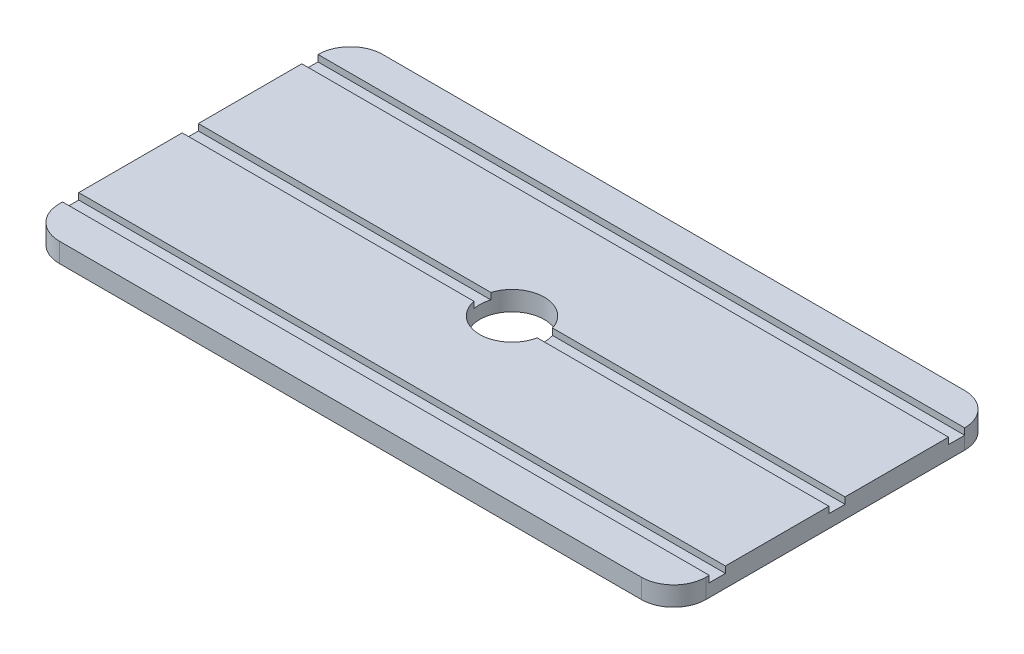
ISO-10303-21;
HEADER;
FILE_DESCRIPTION(('STEP AP214'),'2;1');
FILE_NAME('part.step','',(''),(''),'','','');
FILE_SCHEMA(('AUTOMOTIVE_DESIGN { 1 0 10303 214 1 1 1 1 }'));
ENDSEC;
DATA;
#1=APPLICATION_CONTEXT('core data for automotive mechanical design processes');
#2=APPLICATION_PROTOCOL_DEFINITION('international standard','automotive_design',2000,#1);
#3=PRODUCT_CONTEXT('',#1,'mechanical');
#4=PRODUCT('Part','Part','',(#3));
#5=PRODUCT_RELATED_PRODUCT_CATEGORY('part','',(#4));
#6=PRODUCT_DEFINITION_FORMATION('','',#4);
#7=PRODUCT_DEFINITION_CONTEXT('part definition',#1,'design');
#8=PRODUCT_DEFINITION('design','',#6,#7);
#9=PRODUCT_DEFINITION_SHAPE('','',#8);
#10=(LENGTH_UNIT() NAMED_UNIT(*) SI_UNIT(.MILLI.,.METRE.));
#11=(NAMED_UNIT(*) PLANE_ANGLE_UNIT() SI_UNIT($,.RADIAN.));
#12=(NAMED_UNIT(*) SI_UNIT($,.STERADIAN.) SOLID_ANGLE_UNIT());
#13=UNCERTAINTY_MEASURE_WITH_UNIT(LENGTH_MEASURE(1.E-05),#10,'distance_accuracy_value','');
#14=(GEOMETRIC_REPRESENTATION_CONTEXT(3) GLOBAL_UNCERTAINTY_ASSIGNED_CONTEXT((#13)) GLOBAL_UNIT_ASSIGNED_CONTEXT((#10,
#11,#12)) REPRESENTATION_CONTEXT('',''));
#15=CARTESIAN_POINT('',(0.,0.,0.));
#16=DIRECTION('',(0.,0.,1.));
#17=DIRECTION('',(1.,0.,0.));
#18=AXIS2_PLACEMENT_3D('',#15,#16,#17);
#19=CARTESIAN_POINT('',(-50.,3.,25.));
#20=DIRECTION('',(1.,0.,0.));
#21=DIRECTION('',(0.,0.,-1.));
#22=AXIS2_PLACEMENT_3D('',#19,#20,#21);
#23=PLANE('',#22);
#24=DIRECTION('',(0.,0.,1.));
#25=VECTOR('',#24,1.);
#26=CARTESIAN_POINT('',(-50.,3.,25.));
#27=LINE('',#26,#25);
#28=CARTESIAN_POINT('',(-50.,3.,-17.5));
#29=VERTEX_POINT('',#28);
#30=CARTESIAN_POINT('',(-50.,3.,-1.5));
#31=VERTEX_POINT('',#30);
#32=EDGE_CURVE('E213',#29,#31,#27,.T.);
#33=ORIENTED_EDGE('',*,*,#32,.F.);
#34=DIRECTION('',(0.,1.,0.));
#35=VECTOR('',#34,1.);
#36=CARTESIAN_POINT('',(-50.,2.,-17.5));
#37=LINE('',#36,#35);
#38=CARTESIAN_POINT('',(-50.,2.,-17.5));
#39=VERTEX_POINT('',#38);
#40=EDGE_CURVE('E197',#39,#29,#37,.T.);
#41=ORIENTED_EDGE('',*,*,#40,.F.);
#42=DIRECTION('',(0.,0.,1.));
#43=VECTOR('',#42,1.);
#44=CARTESIAN_POINT('',(-50.,2.,0.));
#45=LINE('',#44,#43);
#46=CARTESIAN_POINT('',(-50.,2.,-20.));
#47=VERTEX_POINT('',#46);
#48=EDGE_CURVE('E201',#47,#39,#45,.T.);
#49=ORIENTED_EDGE('',*,*,#48,.F.);
#50=DIRECTION('',(0.,-1.,0.));
#51=VECTOR('',#50,1.);
#52=CARTESIAN_POINT('',(-50.,3.,-20.));
#53=LINE('',#52,#51);
#54=CARTESIAN_POINT('',(-50.,0.,-20.));
#55=VERTEX_POINT('',#54);
#56=EDGE_CURVE('E332',#47,#55,#53,.T.);
#57=ORIENTED_EDGE('',*,*,#56,.T.);
#58=DIRECTION('',(0.,0.,1.));
#59=VECTOR('',#58,1.);
#60=CARTESIAN_POINT('',(-50.,0.,25.));
#61=LINE('',#60,#59);
#62=CARTESIAN_POINT('',(-50.,0.,20.));
#63=VERTEX_POINT('',#62);
#64=EDGE_CURVE('E299',#55,#63,#61,.T.);
#65=ORIENTED_EDGE('',*,*,#64,.T.);
#66=DIRECTION('',(0.,-1.,0.));
#67=VECTOR('',#66,1.);
#68=CARTESIAN_POINT('',(-50.,3.,20.));
#69=LINE('',#68,#67);
#70=CARTESIAN_POINT('',(-50.,3.,20.));
#71=VERTEX_POINT('',#70);
#72=EDGE_CURVE('E319',#63,#71,#69,.F.);
#73=ORIENTED_EDGE('',*,*,#72,.T.);
#74=CARTESIAN_POINT('',(-50.,3.,19.5));
#75=VERTEX_POINT('',#74);
#76=EDGE_CURVE('E304',#75,#71,#27,.T.);
#77=ORIENTED_EDGE('',*,*,#76,.F.);
#78=DIRECTION('',(0.,1.,0.));
#79=VECTOR('',#78,1.);
#80=CARTESIAN_POINT('',(-50.,2.,19.5));
#81=LINE('',#80,#79);
#82=CARTESIAN_POINT('',(-50.,2.,19.5));
#83=VERTEX_POINT('',#82);
#84=EDGE_CURVE('E53',#83,#75,#81,.T.);
#85=ORIENTED_EDGE('',*,*,#84,.F.);
#86=DIRECTION('',(0.,0.,1.));
#87=VECTOR('',#86,1.);
#88=CARTESIAN_POINT('',(-50.,2.,0.));
#89=LINE('',#88,#87);
#90=CARTESIAN_POINT('',(-50.,2.,17.));
#91=VERTEX_POINT('',#90);
#92=EDGE_CURVE('E272',#91,#83,#89,.T.);
#93=ORIENTED_EDGE('',*,*,#92,.F.);
#94=DIRECTION('',(0.,1.,0.));
#95=VECTOR('',#94,1.);
#96=CARTESIAN_POINT('',(-50.,2.,17.));
#97=LINE('',#96,#95);
#98=CARTESIAN_POINT('',(-50.,3.,17.));
#99=VERTEX_POINT('',#98);
#100=EDGE_CURVE('E261',#91,#99,#97,.T.);
#101=ORIENTED_EDGE('',*,*,#100,.T.);
#102=CARTESIAN_POINT('',(-50.,3.,1.));
#103=VERTEX_POINT('',#102);
#104=EDGE_CURVE('E306',#103,#99,#27,.T.);
#105=ORIENTED_EDGE('',*,*,#104,.F.);
#106=DIRECTION('',(0.,1.,0.));
#107=VECTOR('',#106,1.);
#108=CARTESIAN_POINT('',(-50.,2.,1.));
#109=LINE('',#108,#107);
#110=CARTESIAN_POINT('',(-50.,2.,1.));
#111=VERTEX_POINT('',#110);
#112=EDGE_CURVE('E231',#111,#103,#109,.T.);
#113=ORIENTED_EDGE('',*,*,#112,.F.);
#114=DIRECTION('',(0.,0.,1.));
#115=VECTOR('',#114,1.);
#116=CARTESIAN_POINT('',(-50.,2.,0.));
#117=LINE('',#116,#115);
#118=CARTESIAN_POINT('',(-50.,2.,-1.5));
#119=VERTEX_POINT('',#118);
#120=EDGE_CURVE('E220',#119,#111,#117,.T.);
#121=ORIENTED_EDGE('',*,*,#120,.F.);
#122=DIRECTION('',(0.,1.,0.));
#123=VECTOR('',#122,1.);
#124=CARTESIAN_POINT('',(-50.,2.,-1.5));
#125=LINE('',#124,#123);
#126=EDGE_CURVE('E237',#119,#31,#125,.T.);
#127=ORIENTED_EDGE('',*,*,#126,.T.);
#128=EDGE_LOOP('',(#33,#41,#49,#57,#65,#73,#77,#85,#93,#101,#105,#113,#121,#127));
#129=FACE_BOUND('',#128,.T.);
#130=ADVANCED_FACE('F38',(#129),#23,.F.);
#131=CARTESIAN_POINT('',(50.,3.,25.));
#132=DIRECTION('',(-1.,0.,0.));
#133=DIRECTION('',(0.,0.,1.));
#134=AXIS2_PLACEMENT_3D('',#131,#132,#133);
#135=PLANE('',#134);
#136=DIRECTION('',(0.,0.,-1.));
#137=VECTOR('',#136,1.);
#138=CARTESIAN_POINT('',(50.,2.,0.));
#139=LINE('',#138,#137);
#140=CARTESIAN_POINT('',(50.,2.,-17.5));
#141=VERTEX_POINT('',#140);
#142=CARTESIAN_POINT('',(50.,2.,-20.));
#143=VERTEX_POINT('',#142);
#144=EDGE_CURVE('E61',#141,#143,#139,.T.);
#145=ORIENTED_EDGE('',*,*,#144,.F.);
#146=DIRECTION('',(0.,1.,0.));
#147=VECTOR('',#146,1.);
#148=CARTESIAN_POINT('',(50.,2.,-17.5));
#149=LINE('',#148,#147);
#150=CARTESIAN_POINT('',(50.,3.,-17.5));
#151=VERTEX_POINT('',#150);
#152=EDGE_CURVE('E200',#141,#151,#149,.T.);
#153=ORIENTED_EDGE('',*,*,#152,.T.);
#154=DIRECTION('',(0.,0.,-1.));
#155=VECTOR('',#154,1.);
#156=CARTESIAN_POINT('',(50.,3.,25.));
#157=LINE('',#156,#155);
#158=CARTESIAN_POINT('',(50.,3.,-1.5));
#159=VERTEX_POINT('',#158);
#160=EDGE_CURVE('E311',#159,#151,#157,.T.);
#161=ORIENTED_EDGE('',*,*,#160,.F.);
#162=DIRECTION('',(0.,1.,0.));
#163=VECTOR('',#162,1.);
#164=CARTESIAN_POINT('',(50.,2.,-1.5));
#165=LINE('',#164,#163);
#166=CARTESIAN_POINT('',(50.,2.,-1.5));
#167=VERTEX_POINT('',#166);
#168=EDGE_CURVE('E266',#167,#159,#165,.T.);
#169=ORIENTED_EDGE('',*,*,#168,.F.);
#170=DIRECTION('',(0.,0.,-1.));
#171=VECTOR('',#170,1.);
#172=CARTESIAN_POINT('',(50.,2.,0.));
#173=LINE('',#172,#171);
#174=CARTESIAN_POINT('',(50.,2.,1.));
#175=VERTEX_POINT('',#174);
#176=EDGE_CURVE('E253',#175,#167,#173,.T.);
#177=ORIENTED_EDGE('',*,*,#176,.F.);
#178=DIRECTION('',(0.,1.,0.));
#179=VECTOR('',#178,1.);
#180=CARTESIAN_POINT('',(50.,2.,1.));
#181=LINE('',#180,#179);
#182=CARTESIAN_POINT('',(50.,3.,1.));
#183=VERTEX_POINT('',#182);
#184=EDGE_CURVE('E268',#175,#183,#181,.T.);
#185=ORIENTED_EDGE('',*,*,#184,.T.);
#186=CARTESIAN_POINT('',(50.,3.,17.));
#187=VERTEX_POINT('',#186);
#188=EDGE_CURVE('E316',#187,#183,#157,.T.);
#189=ORIENTED_EDGE('',*,*,#188,.F.);
#190=DIRECTION('',(0.,1.,0.));
#191=VECTOR('',#190,1.);
#192=CARTESIAN_POINT('',(50.,2.,17.));
#193=LINE('',#192,#191);
#194=CARTESIAN_POINT('',(50.,2.,17.));
#195=VERTEX_POINT('',#194);
#196=EDGE_CURVE('E290',#195,#187,#193,.T.);
#197=ORIENTED_EDGE('',*,*,#196,.F.);
#198=DIRECTION('',(0.,0.,-1.));
#199=VECTOR('',#198,1.);
#200=CARTESIAN_POINT('',(50.,2.,0.));
#201=LINE('',#200,#199);
#202=CARTESIAN_POINT('',(50.,2.,19.5));
#203=VERTEX_POINT('',#202);
#204=EDGE_CURVE('E279',#203,#195,#201,.T.);
#205=ORIENTED_EDGE('',*,*,#204,.F.);
#206=DIRECTION('',(0.,1.,0.));
#207=VECTOR('',#206,1.);
#208=CARTESIAN_POINT('',(50.,2.,19.5));
#209=LINE('',#208,#207);
#210=CARTESIAN_POINT('',(50.,3.,19.5));
#211=VERTEX_POINT('',#210);
#212=EDGE_CURVE('E292',#203,#211,#209,.T.);
#213=ORIENTED_EDGE('',*,*,#212,.T.);
#214=CARTESIAN_POINT('',(50.,3.,20.));
#215=VERTEX_POINT('',#214);
#216=EDGE_CURVE('E312',#215,#211,#157,.T.);
#217=ORIENTED_EDGE('',*,*,#216,.F.);
#218=DIRECTION('',(0.,-1.,0.));
#219=VECTOR('',#218,1.);
#220=CARTESIAN_POINT('',(50.,3.,20.));
#221=LINE('',#220,#219);
#222=CARTESIAN_POINT('',(50.,0.,20.));
#223=VERTEX_POINT('',#222);
#224=EDGE_CURVE('E46',#215,#223,#221,.T.);
#225=ORIENTED_EDGE('',*,*,#224,.T.);
#226=DIRECTION('',(0.,0.,-1.));
#227=VECTOR('',#226,1.);
#228=CARTESIAN_POINT('',(50.,0.,25.));
#229=LINE('',#228,#227);
#230=CARTESIAN_POINT('',(50.,0.,-20.));
#231=VERTEX_POINT('',#230);
#232=EDGE_CURVE('E325',#223,#231,#229,.T.);
#233=ORIENTED_EDGE('',*,*,#232,.T.);
#234=DIRECTION('',(0.,-1.,0.));
#235=VECTOR('',#234,1.);
#236=CARTESIAN_POINT('',(50.,3.,-20.));
#237=LINE('',#236,#235);
#238=EDGE_CURVE('E11',#231,#143,#237,.F.);
#239=ORIENTED_EDGE('',*,*,#238,.T.);
#240=EDGE_LOOP('',(#145,#153,#161,#169,#177,#185,#189,#197,#205,#213,#217,#225,#233,#239));
#241=FACE_BOUND('',#240,.T.);
#242=ADVANCED_FACE('F366',(#241),#135,.F.);
#243=CARTESIAN_POINT('',(0.,3.,0.));
#244=DIRECTION('',(0.,1.,0.));
#245=DIRECTION('',(0.,0.,1.));
#246=AXIS2_PLACEMENT_3D('',#243,#244,#245);
#247=PLANE('',#246);
#248=CARTESIAN_POINT('',(-45.,3.,-20.));
#249=DIRECTION('',(0.,1.,0.));
#250=DIRECTION('',(0.,0.,1.));
#251=AXIS2_PLACEMENT_3D('',#248,#249,#250);
#252=CIRCLE('',#251,5.);
#253=CARTESIAN_POINT('',(-45.,3.,-25.));
#254=VERTEX_POINT('',#253);
#255=CARTESIAN_POINT('',(-50.,3.,-20.));
#256=VERTEX_POINT('',#255);
#257=EDGE_CURVE('E354',#254,#256,#252,.T.);
#258=ORIENTED_EDGE('',*,*,#257,.T.);
#259=DIRECTION('',(1.,0.,0.));
#260=VECTOR('',#259,1.);
#261=CARTESIAN_POINT('',(0.,3.,-20.));
#262=LINE('',#261,#260);
#263=CARTESIAN_POINT('',(50.,3.,-20.));
#264=VERTEX_POINT('',#263);
#265=EDGE_CURVE('E208',#256,#264,#262,.T.);
#266=ORIENTED_EDGE('',*,*,#265,.T.);
#267=CARTESIAN_POINT('',(45.,3.,-20.));
#268=DIRECTION('',(0.,1.,0.));
#269=DIRECTION('',(0.,0.,1.));
#270=AXIS2_PLACEMENT_3D('',#267,#268,#269);
#271=CIRCLE('',#270,5.);
#272=CARTESIAN_POINT('',(45.,3.,-25.));
#273=VERTEX_POINT('',#272);
#274=EDGE_CURVE('E350',#264,#273,#271,.T.);
#275=ORIENTED_EDGE('',*,*,#274,.T.);
#276=DIRECTION('',(-1.,0.,0.));
#277=VECTOR('',#276,1.);
#278=CARTESIAN_POINT('',(50.,3.,-25.));
#279=LINE('',#278,#277);
#280=EDGE_CURVE('E315',#273,#254,#279,.T.);
#281=ORIENTED_EDGE('',*,*,#280,.T.);
#282=EDGE_LOOP('',(#258,#266,#275,#281));
#283=FACE_BOUND('',#282,.T.);
#284=ADVANCED_FACE('F386',(#283),#247,.T.);
#285=DIRECTION('',(1.,0.,0.));
#286=VECTOR('',#285,1.);
#287=CARTESIAN_POINT('',(0.,3.,-17.5));
#288=LINE('',#287,#286);
#289=EDGE_CURVE('E239',#29,#151,#288,.T.);
#290=ORIENTED_EDGE('',*,*,#289,.F.);
#291=ORIENTED_EDGE('',*,*,#32,.T.);
#292=DIRECTION('',(1.,0.,0.));
#293=VECTOR('',#292,1.);
#294=CARTESIAN_POINT('',(0.,3.,-1.5));
#295=LINE('',#294,#293);
#296=CARTESIAN_POINT('',(-4.76969600708473,3.,-1.5));
#297=VERTEX_POINT('',#296);
#298=EDGE_CURVE('E224',#31,#297,#295,.T.);
#299=ORIENTED_EDGE('',*,*,#298,.T.);
#300=CARTESIAN_POINT('',(0.,3.,0.));
#301=DIRECTION('',(0.,1.,0.));
#302=DIRECTION('',(0.,0.,1.));
#303=AXIS2_PLACEMENT_3D('',#300,#301,#302);
#304=CIRCLE('',#303,5.);
#305=CARTESIAN_POINT('',(4.76969600708473,3.,-1.50000000000001));
#306=VERTEX_POINT('',#305);
#307=EDGE_CURVE('E300',#306,#297,#304,.T.);
#308=ORIENTED_EDGE('',*,*,#307,.F.);
#309=DIRECTION('',(1.,0.,0.));
#310=VECTOR('',#309,1.);
#311=CARTESIAN_POINT('',(0.,3.,-1.5));
#312=LINE('',#311,#310);
#313=EDGE_CURVE('E250',#306,#159,#312,.T.);
#314=ORIENTED_EDGE('',*,*,#313,.T.);
#315=ORIENTED_EDGE('',*,*,#160,.T.);
#316=EDGE_LOOP('',(#290,#291,#299,#308,#314,#315));
#317=FACE_BOUND('',#316,.T.);
#318=ADVANCED_FACE('F401',(#317),#247,.T.);
#319=DIRECTION('',(1.,0.,0.));
#320=VECTOR('',#319,1.);
#321=CARTESIAN_POINT('',(0.,3.,1.));
#322=LINE('',#321,#320);
#323=CARTESIAN_POINT('',(-4.89897948556636,3.,1.));
#324=VERTEX_POINT('',#323);
#325=EDGE_CURVE('E232',#103,#324,#322,.T.);
#326=ORIENTED_EDGE('',*,*,#325,.F.);
#327=ORIENTED_EDGE('',*,*,#104,.T.);
#328=DIRECTION('',(1.,0.,0.));
#329=VECTOR('',#328,1.);
#330=CARTESIAN_POINT('',(0.,3.,17.));
#331=LINE('',#330,#329);
#332=EDGE_CURVE('E276',#99,#187,#331,.T.);
#333=ORIENTED_EDGE('',*,*,#332,.T.);
#334=ORIENTED_EDGE('',*,*,#188,.T.);
#335=DIRECTION('',(1.,0.,0.));
#336=VECTOR('',#335,1.);
#337=CARTESIAN_POINT('',(0.,3.,1.));
#338=LINE('',#337,#336);
#339=CARTESIAN_POINT('',(4.89897948556636,3.,1.));
#340=VERTEX_POINT('',#339);
#341=EDGE_CURVE('E259',#340,#183,#338,.T.);
#342=ORIENTED_EDGE('',*,*,#341,.F.);
#343=EDGE_CURVE('E301',#324,#340,#304,.T.);
#344=ORIENTED_EDGE('',*,*,#343,.F.);
#345=EDGE_LOOP('',(#326,#327,#333,#334,#342,#344));
#346=FACE_BOUND('',#345,.T.);
#347=ADVANCED_FACE('F408',(#346),#247,.T.);
#348=CARTESIAN_POINT('',(0.,0.,0.));
#349=DIRECTION('',(0.,1.,0.));
#350=DIRECTION('',(0.,0.,1.));
#351=AXIS2_PLACEMENT_3D('',#348,#349,#350);
#352=CYLINDRICAL_SURFACE('',#351,5.);
#353=CARTESIAN_POINT('',(0.,0.,0.));
#354=DIRECTION('',(0.,1.,0.));
#355=DIRECTION('',(0.,0.,1.));
#356=AXIS2_PLACEMENT_3D('',#353,#354,#355);
#357=CIRCLE('',#356,5.);
#358=CARTESIAN_POINT('',(0.,0.,5.));
#359=VERTEX_POINT('',#358);
#360=EDGE_CURVE('E296',#359,#359,#357,.T.);
#361=ORIENTED_EDGE('',*,*,#360,.F.);
#362=EDGE_LOOP('',(#361));
#363=FACE_BOUND('',#362,.T.);
#364=DIRECTION('',(0.,1.,0.));
#365=VECTOR('',#364,1.);
#366=CARTESIAN_POINT('',(-4.76969600708473,2.,-1.5));
#367=LINE('',#366,#365);
#368=CARTESIAN_POINT('',(-4.76969600708473,2.,-1.5));
#369=VERTEX_POINT('',#368);
#370=EDGE_CURVE('E240',#369,#297,#367,.T.);
#371=ORIENTED_EDGE('',*,*,#370,.F.);
#372=CARTESIAN_POINT('',(0.,2.,0.));
#373=DIRECTION('',(0.,1.,0.));
#374=DIRECTION('',(0.,0.,1.));
#375=AXIS2_PLACEMENT_3D('',#372,#373,#374);
#376=CIRCLE('',#375,5.);
#377=CARTESIAN_POINT('',(-4.89897948556636,2.,1.));
#378=VERTEX_POINT('',#377);
#379=EDGE_CURVE('E226',#378,#369,#376,.F.);
#380=ORIENTED_EDGE('',*,*,#379,.F.);
#381=DIRECTION('',(0.,1.,0.));
#382=VECTOR('',#381,1.);
#383=CARTESIAN_POINT('',(-4.89897948556636,2.,1.));
#384=LINE('',#383,#382);
#385=EDGE_CURVE('E242',#378,#324,#384,.T.);
#386=ORIENTED_EDGE('',*,*,#385,.T.);
#387=ORIENTED_EDGE('',*,*,#343,.T.);
#388=DIRECTION('',(0.,1.,0.));
#389=VECTOR('',#388,1.);
#390=CARTESIAN_POINT('',(4.89897948556636,2.,1.));
#391=LINE('',#390,#389);
#392=CARTESIAN_POINT('',(4.89897948556636,2.,1.));
#393=VERTEX_POINT('',#392);
#394=EDGE_CURVE('E258',#393,#340,#391,.T.);
#395=ORIENTED_EDGE('',*,*,#394,.F.);
#396=CARTESIAN_POINT('',(0.,2.,0.));
#397=DIRECTION('',(0.,1.,0.));
#398=DIRECTION('',(0.,0.,1.));
#399=AXIS2_PLACEMENT_3D('',#396,#397,#398);
#400=CIRCLE('',#399,5.);
#401=CARTESIAN_POINT('',(4.76969600708473,2.,-1.50000000000001));
#402=VERTEX_POINT('',#401);
#403=EDGE_CURVE('E246',#402,#393,#400,.F.);
#404=ORIENTED_EDGE('',*,*,#403,.F.);
#405=DIRECTION('',(0.,1.,0.));
#406=VECTOR('',#405,1.);
#407=CARTESIAN_POINT('',(4.76969600708473,2.,-1.50000000000001));
#408=LINE('',#407,#406);
#409=EDGE_CURVE('E234',#402,#306,#408,.T.);
#410=ORIENTED_EDGE('',*,*,#409,.T.);
#411=ORIENTED_EDGE('',*,*,#307,.T.);
#412=EDGE_LOOP('',(#371,#380,#386,#387,#395,#404,#410,#411));
#413=FACE_BOUND('',#412,.T.);
#414=ADVANCED_FACE('F423',(#363,#413),#352,.F.);
#415=CARTESIAN_POINT('',(50.,3.,25.));
#416=DIRECTION('',(0.,0.,-1.));
#417=DIRECTION('',(-1.,0.,0.));
#418=AXIS2_PLACEMENT_3D('',#415,#416,#417);
#419=PLANE('',#418);
#420=DIRECTION('',(1.,0.,0.));
#421=VECTOR('',#420,1.);
#422=CARTESIAN_POINT('',(50.,3.,25.));
#423=LINE('',#422,#421);
#424=CARTESIAN_POINT('',(-45.,3.,25.));
#425=VERTEX_POINT('',#424);
#426=CARTESIAN_POINT('',(45.,3.,25.));
#427=VERTEX_POINT('',#426);
#428=EDGE_CURVE('E308',#425,#427,#423,.T.);
#429=ORIENTED_EDGE('',*,*,#428,.F.);
#430=DIRECTION('',(0.,-1.,0.));
#431=VECTOR('',#430,1.);
#432=CARTESIAN_POINT('',(-45.,3.,25.));
#433=LINE('',#432,#431);
#434=CARTESIAN_POINT('',(-45.,0.,25.));
#435=VERTEX_POINT('',#434);
#436=EDGE_CURVE('E359',#425,#435,#433,.T.);
#437=ORIENTED_EDGE('',*,*,#436,.T.);
#438=DIRECTION('',(1.,0.,0.));
#439=VECTOR('',#438,1.);
#440=CARTESIAN_POINT('',(50.,0.,25.));
#441=LINE('',#440,#439);
#442=CARTESIAN_POINT('',(45.,0.,25.));
#443=VERTEX_POINT('',#442);
#444=EDGE_CURVE('E322',#435,#443,#441,.T.);
#445=ORIENTED_EDGE('',*,*,#444,.T.);
#446=DIRECTION('',(0.,-1.,0.));
#447=VECTOR('',#446,1.);
#448=CARTESIAN_POINT('',(45.,3.,25.));
#449=LINE('',#448,#447);
#450=EDGE_CURVE('E357',#443,#427,#449,.F.);
#451=ORIENTED_EDGE('',*,*,#450,.T.);
#452=EDGE_LOOP('',(#429,#437,#445,#451));
#453=FACE_BOUND('',#452,.T.);
#454=ADVANCED_FACE('F451',(#453),#419,.F.);
#455=CARTESIAN_POINT('',(50.,3.,-25.));
#456=DIRECTION('',(0.,0.,1.));
#457=DIRECTION('',(1.,0.,0.));
#458=AXIS2_PLACEMENT_3D('',#455,#456,#457);
#459=PLANE('',#458);
#460=DIRECTION('',(-1.,0.,0.));
#461=VECTOR('',#460,1.);
#462=CARTESIAN_POINT('',(50.,0.,-25.));
#463=LINE('',#462,#461);
#464=CARTESIAN_POINT('',(45.,0.,-25.));
#465=VERTEX_POINT('',#464);
#466=CARTESIAN_POINT('',(-45.,0.,-25.));
#467=VERTEX_POINT('',#466);
#468=EDGE_CURVE('E307',#465,#467,#463,.T.);
#469=ORIENTED_EDGE('',*,*,#468,.T.);
#470=DIRECTION('',(0.,-1.,0.));
#471=VECTOR('',#470,1.);
#472=CARTESIAN_POINT('',(-45.,3.,-25.));
#473=LINE('',#472,#471);
#474=EDGE_CURVE('E346',#467,#254,#473,.F.);
#475=ORIENTED_EDGE('',*,*,#474,.T.);
#476=ORIENTED_EDGE('',*,*,#280,.F.);
#477=DIRECTION('',(0.,-1.,0.));
#478=VECTOR('',#477,1.);
#479=CARTESIAN_POINT('',(45.,3.,-25.));
#480=LINE('',#479,#478);
#481=EDGE_CURVE('E343',#273,#465,#480,.T.);
#482=ORIENTED_EDGE('',*,*,#481,.T.);
#483=EDGE_LOOP('',(#469,#475,#476,#482));
#484=FACE_BOUND('',#483,.T.);
#485=ADVANCED_FACE('F382',(#484),#459,.F.);
#486=DIRECTION('',(1.,0.,0.));
#487=VECTOR('',#486,1.);
#488=CARTESIAN_POINT('',(0.,3.,19.5));
#489=LINE('',#488,#487);
#490=EDGE_CURVE('E284',#75,#211,#489,.T.);
#491=ORIENTED_EDGE('',*,*,#490,.F.);
#492=ORIENTED_EDGE('',*,*,#76,.T.);
#493=CARTESIAN_POINT('',(-45.,3.,20.));
#494=DIRECTION('',(0.,1.,0.));
#495=DIRECTION('',(0.,0.,1.));
#496=AXIS2_PLACEMENT_3D('',#493,#494,#495);
#497=CIRCLE('',#496,5.);
#498=EDGE_CURVE('E352',#71,#425,#497,.T.);
#499=ORIENTED_EDGE('',*,*,#498,.T.);
#500=ORIENTED_EDGE('',*,*,#428,.T.);
#501=CARTESIAN_POINT('',(45.,3.,20.));
#502=DIRECTION('',(0.,1.,0.));
#503=DIRECTION('',(0.,0.,1.));
#504=AXIS2_PLACEMENT_3D('',#501,#502,#503);
#505=CIRCLE('',#504,5.);
#506=EDGE_CURVE('E348',#427,#215,#505,.T.);
#507=ORIENTED_EDGE('',*,*,#506,.T.);
#508=ORIENTED_EDGE('',*,*,#216,.T.);
#509=EDGE_LOOP('',(#491,#492,#499,#500,#507,#508));
#510=FACE_BOUND('',#509,.T.);
#511=ADVANCED_FACE('F480',(#510),#247,.T.);
#512=CARTESIAN_POINT('',(0.,0.,0.));
#513=DIRECTION('',(0.,1.,0.));
#514=DIRECTION('',(0.,0.,1.));
#515=AXIS2_PLACEMENT_3D('',#512,#513,#514);
#516=PLANE('',#515);
#517=ORIENTED_EDGE('',*,*,#360,.T.);
#518=EDGE_LOOP('',(#517));
#519=FACE_BOUND('',#518,.T.);
#520=ORIENTED_EDGE('',*,*,#64,.F.);
#521=CARTESIAN_POINT('',(-45.,0.,-20.));
#522=DIRECTION('',(0.,1.,0.));
#523=DIRECTION('',(0.,0.,1.));
#524=AXIS2_PLACEMENT_3D('',#521,#522,#523);
#525=CIRCLE('',#524,5.);
#526=EDGE_CURVE('E341',#55,#467,#525,.F.);
#527=ORIENTED_EDGE('',*,*,#526,.T.);
#528=ORIENTED_EDGE('',*,*,#468,.F.);
#529=CARTESIAN_POINT('',(45.,0.,-20.));
#530=DIRECTION('',(0.,1.,0.));
#531=DIRECTION('',(0.,0.,1.));
#532=AXIS2_PLACEMENT_3D('',#529,#530,#531);
#533=CIRCLE('',#532,5.);
#534=EDGE_CURVE('E337',#465,#231,#533,.F.);
#535=ORIENTED_EDGE('',*,*,#534,.T.);
#536=ORIENTED_EDGE('',*,*,#232,.F.);
#537=CARTESIAN_POINT('',(45.,0.,20.));
#538=DIRECTION('',(0.,1.,0.));
#539=DIRECTION('',(0.,0.,1.));
#540=AXIS2_PLACEMENT_3D('',#537,#538,#539);
#541=CIRCLE('',#540,5.);
#542=EDGE_CURVE('E335',#223,#443,#541,.F.);
#543=ORIENTED_EDGE('',*,*,#542,.T.);
#544=ORIENTED_EDGE('',*,*,#444,.F.);
#545=CARTESIAN_POINT('',(-45.,0.,20.));
#546=DIRECTION('',(0.,1.,0.));
#547=DIRECTION('',(0.,0.,1.));
#548=AXIS2_PLACEMENT_3D('',#545,#546,#547);
#549=CIRCLE('',#548,5.);
#550=EDGE_CURVE('E339',#435,#63,#549,.F.);
#551=ORIENTED_EDGE('',*,*,#550,.T.);
#552=EDGE_LOOP('',(#520,#527,#528,#535,#536,#543,#544,#551));
#553=FACE_BOUND('',#552,.T.);
#554=ADVANCED_FACE('F372',(#519,#553),#516,.F.);
#555=CARTESIAN_POINT('',(-45.,3.,-20.));
#556=DIRECTION('',(0.,-1.,0.));
#557=DIRECTION('',(0.,0.,-1.));
#558=AXIS2_PLACEMENT_3D('',#555,#556,#557);
#559=CYLINDRICAL_SURFACE('',#558,5.);
#560=ORIENTED_EDGE('',*,*,#257,.F.);
#561=ORIENTED_EDGE('',*,*,#474,.F.);
#562=ORIENTED_EDGE('',*,*,#526,.F.);
#563=ORIENTED_EDGE('',*,*,#56,.F.);
#564=EDGE_CURVE('E333',#256,#47,#53,.T.);
#565=ORIENTED_EDGE('',*,*,#564,.F.);
#566=EDGE_LOOP('',(#560,#561,#562,#563,#565));
#567=FACE_BOUND('',#566,.T.);
#568=ADVANCED_FACE('F390',(#567),#559,.T.);
#569=CARTESIAN_POINT('',(-45.,3.,20.));
#570=DIRECTION('',(0.,-1.,0.));
#571=DIRECTION('',(0.,0.,-1.));
#572=AXIS2_PLACEMENT_3D('',#569,#570,#571);
#573=CYLINDRICAL_SURFACE('',#572,5.);
#574=ORIENTED_EDGE('',*,*,#498,.F.);
#575=ORIENTED_EDGE('',*,*,#72,.F.);
#576=ORIENTED_EDGE('',*,*,#550,.F.);
#577=ORIENTED_EDGE('',*,*,#436,.F.);
#578=EDGE_LOOP('',(#574,#575,#576,#577));
#579=FACE_BOUND('',#578,.T.);
#580=ADVANCED_FACE('F454',(#579),#573,.T.);
#581=CARTESIAN_POINT('',(45.,3.,-20.));
#582=DIRECTION('',(0.,-1.,0.));
#583=DIRECTION('',(0.,0.,-1.));
#584=AXIS2_PLACEMENT_3D('',#581,#582,#583);
#585=CYLINDRICAL_SURFACE('',#584,5.);
#586=ORIENTED_EDGE('',*,*,#274,.F.);
#587=DIRECTION('',(0.,1.,0.));
#588=VECTOR('',#587,1.);
#589=CARTESIAN_POINT('',(50.,2.,-20.));
#590=LINE('',#589,#588);
#591=EDGE_CURVE('E215',#143,#264,#590,.T.);
#592=ORIENTED_EDGE('',*,*,#591,.F.);
#593=ORIENTED_EDGE('',*,*,#238,.F.);
#594=ORIENTED_EDGE('',*,*,#534,.F.);
#595=ORIENTED_EDGE('',*,*,#481,.F.);
#596=EDGE_LOOP('',(#586,#592,#593,#594,#595));
#597=FACE_BOUND('',#596,.T.);
#598=ADVANCED_FACE('F378',(#597),#585,.T.);
#599=CARTESIAN_POINT('',(45.,3.,20.));
#600=DIRECTION('',(0.,-1.,0.));
#601=DIRECTION('',(0.,0.,-1.));
#602=AXIS2_PLACEMENT_3D('',#599,#600,#601);
#603=CYLINDRICAL_SURFACE('',#602,5.);
#604=ORIENTED_EDGE('',*,*,#506,.F.);
#605=ORIENTED_EDGE('',*,*,#450,.F.);
#606=ORIENTED_EDGE('',*,*,#542,.F.);
#607=ORIENTED_EDGE('',*,*,#224,.F.);
#608=EDGE_LOOP('',(#604,#605,#606,#607));
#609=FACE_BOUND('',#608,.T.);
#610=ADVANCED_FACE('F40',(#609),#603,.T.);
#611=CARTESIAN_POINT('',(0.,2.,-1.5));
#612=DIRECTION('',(0.,0.,1.));
#613=DIRECTION('',(1.,0.,0.));
#614=AXIS2_PLACEMENT_3D('',#611,#612,#613);
#615=PLANE('',#614);
#616=ORIENTED_EDGE('',*,*,#313,.F.);
#617=ORIENTED_EDGE('',*,*,#409,.F.);
#618=DIRECTION('',(1.,0.,0.));
#619=VECTOR('',#618,1.);
#620=CARTESIAN_POINT('',(0.,2.,-1.5));
#621=LINE('',#620,#619);
#622=EDGE_CURVE('E256',#402,#167,#621,.T.);
#623=ORIENTED_EDGE('',*,*,#622,.T.);
#624=ORIENTED_EDGE('',*,*,#168,.T.);
#625=EDGE_LOOP('',(#616,#617,#623,#624));
#626=FACE_BOUND('',#625,.T.);
#627=ADVANCED_FACE('F434',(#626),#615,.T.);
#628=CARTESIAN_POINT('',(0.,2.,1.));
#629=DIRECTION('',(0.,0.,1.));
#630=DIRECTION('',(1.,0.,0.));
#631=AXIS2_PLACEMENT_3D('',#628,#629,#630);
#632=PLANE('',#631);
#633=ORIENTED_EDGE('',*,*,#341,.T.);
#634=ORIENTED_EDGE('',*,*,#184,.F.);
#635=DIRECTION('',(1.,0.,0.));
#636=VECTOR('',#635,1.);
#637=CARTESIAN_POINT('',(0.,2.,1.));
#638=LINE('',#637,#636);
#639=EDGE_CURVE('E249',#393,#175,#638,.T.);
#640=ORIENTED_EDGE('',*,*,#639,.F.);
#641=ORIENTED_EDGE('',*,*,#394,.T.);
#642=EDGE_LOOP('',(#633,#634,#640,#641));
#643=FACE_BOUND('',#642,.T.);
#644=ADVANCED_FACE('F415',(#643),#632,.F.);
#645=CARTESIAN_POINT('',(0.,2.,0.));
#646=DIRECTION('',(0.,1.,0.));
#647=DIRECTION('',(0.,0.,1.));
#648=AXIS2_PLACEMENT_3D('',#645,#646,#647);
#649=PLANE('',#648);
#650=ORIENTED_EDGE('',*,*,#403,.T.);
#651=ORIENTED_EDGE('',*,*,#639,.T.);
#652=ORIENTED_EDGE('',*,*,#176,.T.);
#653=ORIENTED_EDGE('',*,*,#622,.F.);
#654=EDGE_LOOP('',(#650,#651,#652,#653));
#655=FACE_BOUND('',#654,.T.);
#656=ADVANCED_FACE('F417',(#655),#649,.T.);
#657=CARTESIAN_POINT('',(0.,2.,-1.5));
#658=DIRECTION('',(0.,0.,1.));
#659=DIRECTION('',(1.,0.,0.));
#660=AXIS2_PLACEMENT_3D('',#657,#658,#659);
#661=PLANE('',#660);
#662=ORIENTED_EDGE('',*,*,#298,.F.);
#663=ORIENTED_EDGE('',*,*,#126,.F.);
#664=DIRECTION('',(1.,0.,0.));
#665=VECTOR('',#664,1.);
#666=CARTESIAN_POINT('',(0.,2.,-1.5));
#667=LINE('',#666,#665);
#668=EDGE_CURVE('E229',#119,#369,#667,.T.);
#669=ORIENTED_EDGE('',*,*,#668,.T.);
#670=ORIENTED_EDGE('',*,*,#370,.T.);
#671=EDGE_LOOP('',(#662,#663,#669,#670));
#672=FACE_BOUND('',#671,.T.);
#673=ADVANCED_FACE('F658',(#672),#661,.T.);
#674=CARTESIAN_POINT('',(0.,2.,1.));
#675=DIRECTION('',(0.,0.,1.));
#676=DIRECTION('',(1.,0.,0.));
#677=AXIS2_PLACEMENT_3D('',#674,#675,#676);
#678=PLANE('',#677);
#679=ORIENTED_EDGE('',*,*,#325,.T.);
#680=ORIENTED_EDGE('',*,*,#385,.F.);
#681=DIRECTION('',(1.,0.,0.));
#682=VECTOR('',#681,1.);
#683=CARTESIAN_POINT('',(0.,2.,1.));
#684=LINE('',#683,#682);
#685=EDGE_CURVE('E223',#111,#378,#684,.T.);
#686=ORIENTED_EDGE('',*,*,#685,.F.);
#687=ORIENTED_EDGE('',*,*,#112,.T.);
#688=EDGE_LOOP('',(#679,#680,#686,#687));
#689=FACE_BOUND('',#688,.T.);
#690=ADVANCED_FACE('F647',(#689),#678,.F.);
#691=CARTESIAN_POINT('',(0.,2.,0.));
#692=DIRECTION('',(0.,1.,0.));
#693=DIRECTION('',(0.,0.,1.));
#694=AXIS2_PLACEMENT_3D('',#691,#692,#693);
#695=PLANE('',#694);
#696=ORIENTED_EDGE('',*,*,#120,.T.);
#697=ORIENTED_EDGE('',*,*,#685,.T.);
#698=ORIENTED_EDGE('',*,*,#379,.T.);
#699=ORIENTED_EDGE('',*,*,#668,.F.);
#700=EDGE_LOOP('',(#696,#697,#698,#699));
#701=FACE_BOUND('',#700,.T.);
#702=ADVANCED_FACE('F637',(#701),#695,.T.);
#703=CARTESIAN_POINT('',(0.,2.,-20.));
#704=DIRECTION('',(0.,0.,1.));
#705=DIRECTION('',(1.,0.,0.));
#706=AXIS2_PLACEMENT_3D('',#703,#704,#705);
#707=PLANE('',#706);
#708=ORIENTED_EDGE('',*,*,#265,.F.);
#709=ORIENTED_EDGE('',*,*,#564,.T.);
#710=DIRECTION('',(1.,0.,0.));
#711=VECTOR('',#710,1.);
#712=CARTESIAN_POINT('',(0.,2.,-20.));
#713=LINE('',#712,#711);
#714=EDGE_CURVE('E205',#47,#143,#713,.T.);
#715=ORIENTED_EDGE('',*,*,#714,.T.);
#716=ORIENTED_EDGE('',*,*,#591,.T.);
#717=EDGE_LOOP('',(#708,#709,#715,#716));
#718=FACE_BOUND('',#717,.T.);
#719=ADVANCED_FACE('F393',(#718),#707,.T.);
#720=CARTESIAN_POINT('',(0.,2.,-17.5));
#721=DIRECTION('',(0.,0.,1.));
#722=DIRECTION('',(1.,0.,0.));
#723=AXIS2_PLACEMENT_3D('',#720,#721,#722);
#724=PLANE('',#723);
#725=ORIENTED_EDGE('',*,*,#289,.T.);
#726=ORIENTED_EDGE('',*,*,#152,.F.);
#727=DIRECTION('',(1.,0.,0.));
#728=VECTOR('',#727,1.);
#729=CARTESIAN_POINT('',(0.,2.,-17.5));
#730=LINE('',#729,#728);
#731=EDGE_CURVE('E193',#39,#141,#730,.T.);
#732=ORIENTED_EDGE('',*,*,#731,.F.);
#733=ORIENTED_EDGE('',*,*,#40,.T.);
#734=EDGE_LOOP('',(#725,#726,#732,#733));
#735=FACE_BOUND('',#734,.T.);
#736=ADVANCED_FACE('F195',(#735),#724,.F.);
#737=CARTESIAN_POINT('',(0.,2.,0.));
#738=DIRECTION('',(0.,1.,0.));
#739=DIRECTION('',(0.,0.,1.));
#740=AXIS2_PLACEMENT_3D('',#737,#738,#739);
#741=PLANE('',#740);
#742=ORIENTED_EDGE('',*,*,#48,.T.);
#743=ORIENTED_EDGE('',*,*,#731,.T.);
#744=ORIENTED_EDGE('',*,*,#144,.T.);
#745=ORIENTED_EDGE('',*,*,#714,.F.);
#746=EDGE_LOOP('',(#742,#743,#744,#745));
#747=FACE_BOUND('',#746,.T.);
#748=ADVANCED_FACE('F204',(#747),#741,.T.);
#749=CARTESIAN_POINT('',(0.,2.,17.));
#750=DIRECTION('',(0.,0.,1.));
#751=DIRECTION('',(1.,0.,0.));
#752=AXIS2_PLACEMENT_3D('',#749,#750,#751);
#753=PLANE('',#752);
#754=ORIENTED_EDGE('',*,*,#332,.F.);
#755=ORIENTED_EDGE('',*,*,#100,.F.);
#756=DIRECTION('',(1.,0.,0.));
#757=VECTOR('',#756,1.);
#758=CARTESIAN_POINT('',(0.,2.,17.));
#759=LINE('',#758,#757);
#760=EDGE_CURVE('E282',#91,#195,#759,.T.);
#761=ORIENTED_EDGE('',*,*,#760,.T.);
#762=ORIENTED_EDGE('',*,*,#196,.T.);
#763=EDGE_LOOP('',(#754,#755,#761,#762));
#764=FACE_BOUND('',#763,.T.);
#765=ADVANCED_FACE('F589',(#764),#753,.T.);
#766=CARTESIAN_POINT('',(0.,2.,19.5));
#767=DIRECTION('',(0.,0.,1.));
#768=DIRECTION('',(1.,0.,0.));
#769=AXIS2_PLACEMENT_3D('',#766,#767,#768);
#770=PLANE('',#769);
#771=ORIENTED_EDGE('',*,*,#490,.T.);
#772=ORIENTED_EDGE('',*,*,#212,.F.);
#773=DIRECTION('',(1.,0.,0.));
#774=VECTOR('',#773,1.);
#775=CARTESIAN_POINT('',(0.,2.,19.5));
#776=LINE('',#775,#774);
#777=EDGE_CURVE('E275',#83,#203,#776,.T.);
#778=ORIENTED_EDGE('',*,*,#777,.F.);
#779=ORIENTED_EDGE('',*,*,#84,.T.);
#780=EDGE_LOOP('',(#771,#772,#778,#779));
#781=FACE_BOUND('',#780,.T.);
#782=ADVANCED_FACE('F584',(#781),#770,.F.);
#783=CARTESIAN_POINT('',(0.,2.,0.));
#784=DIRECTION('',(0.,1.,0.));
#785=DIRECTION('',(0.,0.,1.));
#786=AXIS2_PLACEMENT_3D('',#783,#784,#785);
#787=PLANE('',#786);
#788=ORIENTED_EDGE('',*,*,#92,.T.);
#789=ORIENTED_EDGE('',*,*,#777,.T.);
#790=ORIENTED_EDGE('',*,*,#204,.T.);
#791=ORIENTED_EDGE('',*,*,#760,.F.);
#792=EDGE_LOOP('',(#788,#789,#790,#791));
#793=FACE_BOUND('',#792,.T.);
#794=ADVANCED_FACE('F587',(#793),#787,.T.);
#795=CLOSED_SHELL('',(#130,#242,#284,#318,#347,#414,#454,#485,#511,#554,#568,#580,#598,#610,
#627,#644,#656,#673,#690,#702,#719,#736,#748,#765,#782,#794));
#796=MANIFOLD_SOLID_BREP('B2',#795);
#797=ADVANCED_BREP_SHAPE_REPRESENTATION('',(#18,#796),#14);
#798=SHAPE_DEFINITION_REPRESENTATION(#9,#797);
ENDSEC;
END-ISO-10303-21;
